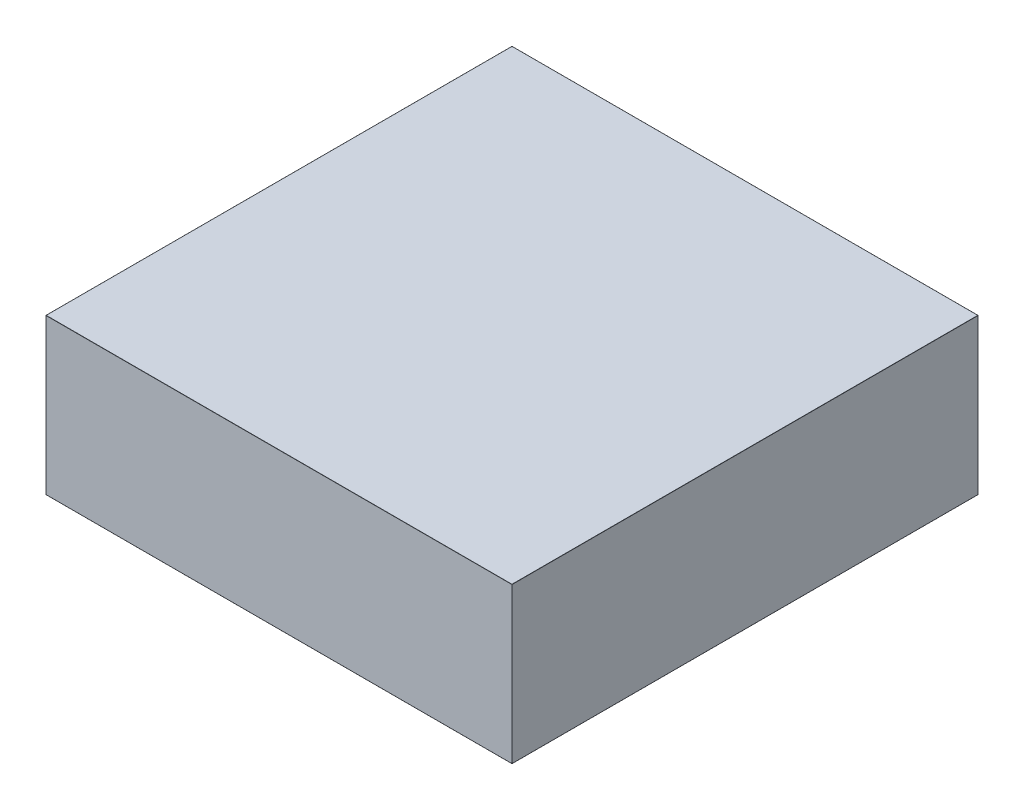
ISO-10303-21;
HEADER;
FILE_DESCRIPTION(('STEP AP214'),'2;1');
FILE_NAME('part.step','',(''),(''),'','','');
FILE_SCHEMA(('AUTOMOTIVE_DESIGN { 1 0 10303 214 1 1 1 1 }'));
ENDSEC;
DATA;
#1=APPLICATION_CONTEXT('core data for automotive mechanical design processes');
#2=APPLICATION_PROTOCOL_DEFINITION('international standard','automotive_design',2000,#1);
#3=PRODUCT_CONTEXT('',#1,'mechanical');
#4=PRODUCT('Part','Part','',(#3));
#5=PRODUCT_RELATED_PRODUCT_CATEGORY('part','',(#4));
#6=PRODUCT_DEFINITION_FORMATION('','',#4);
#7=PRODUCT_DEFINITION_CONTEXT('part definition',#1,'design');
#8=PRODUCT_DEFINITION('design','',#6,#7);
#9=PRODUCT_DEFINITION_SHAPE('','',#8);
#10=(LENGTH_UNIT() NAMED_UNIT(*) SI_UNIT(.MILLI.,.METRE.));
#11=(NAMED_UNIT(*) PLANE_ANGLE_UNIT() SI_UNIT($,.RADIAN.));
#12=(NAMED_UNIT(*) SI_UNIT($,.STERADIAN.) SOLID_ANGLE_UNIT());
#13=UNCERTAINTY_MEASURE_WITH_UNIT(LENGTH_MEASURE(1.E-05),#10,'distance_accuracy_value','');
#14=(GEOMETRIC_REPRESENTATION_CONTEXT(3) GLOBAL_UNCERTAINTY_ASSIGNED_CONTEXT((#13)) GLOBAL_UNIT_ASSIGNED_CONTEXT((#10,
#11,#12)) REPRESENTATION_CONTEXT('',''));
#15=CARTESIAN_POINT('',(0.,0.,0.));
#16=DIRECTION('',(0.,0.,1.));
#17=DIRECTION('',(1.,0.,0.));
#18=AXIS2_PLACEMENT_3D('',#15,#16,#17);
#19=CARTESIAN_POINT('',(150.,-50.,150.));
#20=DIRECTION('',(-1.,0.,0.));
#21=DIRECTION('',(0.,0.,1.));
#22=AXIS2_PLACEMENT_3D('',#19,#20,#21);
#23=PLANE('',#22);
#24=DIRECTION('',(0.,1.,0.));
#25=VECTOR('',#24,1.);
#26=CARTESIAN_POINT('',(150.,-50.,149.9));
#27=LINE('',#26,#25);
#28=CARTESIAN_POINT('',(150.,49.9,149.9));
#29=VERTEX_POINT('',#28);
#30=CARTESIAN_POINT('',(150.,-49.9,149.9));
#31=VERTEX_POINT('',#30);
#32=EDGE_CURVE('E183',#29,#31,#27,.F.);
#33=ORIENTED_EDGE('',*,*,#32,.T.);
#34=DIRECTION('',(0.,0.,-1.));
#35=VECTOR('',#34,1.);
#36=CARTESIAN_POINT('',(150.,-49.9,150.));
#37=LINE('',#36,#35);
#38=CARTESIAN_POINT('',(150.,-49.9,-149.9));
#39=VERTEX_POINT('',#38);
#40=EDGE_CURVE('E187',#31,#39,#37,.T.);
#41=ORIENTED_EDGE('',*,*,#40,.T.);
#42=DIRECTION('',(0.,1.,0.));
#43=VECTOR('',#42,1.);
#44=CARTESIAN_POINT('',(150.,50.,-149.9));
#45=LINE('',#44,#43);
#46=CARTESIAN_POINT('',(150.,49.9,-149.9));
#47=VERTEX_POINT('',#46);
#48=EDGE_CURVE('E185',#39,#47,#45,.T.);
#49=ORIENTED_EDGE('',*,*,#48,.T.);
#50=DIRECTION('',(0.,0.,-1.));
#51=VECTOR('',#50,1.);
#52=CARTESIAN_POINT('',(150.,49.9,150.));
#53=LINE('',#52,#51);
#54=EDGE_CURVE('E181',#47,#29,#53,.F.);
#55=ORIENTED_EDGE('',*,*,#54,.T.);
#56=EDGE_LOOP('',(#33,#41,#49,#55));
#57=FACE_BOUND('',#56,.T.);
#58=ADVANCED_FACE('F33',(#57),#23,.F.);
#59=CARTESIAN_POINT('',(-150.,50.,150.));
#60=DIRECTION('',(0.,-1.,0.));
#61=DIRECTION('',(0.,0.,-1.));
#62=AXIS2_PLACEMENT_3D('',#59,#60,#61);
#63=PLANE('',#62);
#64=DIRECTION('',(-1.,0.,0.));
#65=VECTOR('',#64,1.);
#66=CARTESIAN_POINT('',(-150.,50.,149.9));
#67=LINE('',#66,#65);
#68=CARTESIAN_POINT('',(-149.9,50.,149.9));
#69=VERTEX_POINT('',#68);
#70=CARTESIAN_POINT('',(149.9,50.,149.9));
#71=VERTEX_POINT('',#70);
#72=EDGE_CURVE('E42',#69,#71,#67,.F.);
#73=ORIENTED_EDGE('',*,*,#72,.T.);
#74=DIRECTION('',(0.,0.,-1.));
#75=VECTOR('',#74,1.);
#76=CARTESIAN_POINT('',(149.9,50.,150.));
#77=LINE('',#76,#75);
#78=CARTESIAN_POINT('',(149.9,50.,-149.9));
#79=VERTEX_POINT('',#78);
#80=EDGE_CURVE('E11',#71,#79,#77,.T.);
#81=ORIENTED_EDGE('',*,*,#80,.T.);
#82=DIRECTION('',(-1.,0.,0.));
#83=VECTOR('',#82,1.);
#84=CARTESIAN_POINT('',(-150.,50.,-149.9));
#85=LINE('',#84,#83);
#86=CARTESIAN_POINT('',(-149.9,50.,-149.9));
#87=VERTEX_POINT('',#86);
#88=EDGE_CURVE('E198',#79,#87,#85,.T.);
#89=ORIENTED_EDGE('',*,*,#88,.T.);
#90=DIRECTION('',(0.,0.,-1.));
#91=VECTOR('',#90,1.);
#92=CARTESIAN_POINT('',(-149.9,50.,150.));
#93=LINE('',#92,#91);
#94=EDGE_CURVE('E53',#87,#69,#93,.F.);
#95=ORIENTED_EDGE('',*,*,#94,.T.);
#96=EDGE_LOOP('',(#73,#81,#89,#95));
#97=FACE_BOUND('',#96,.T.);
#98=ADVANCED_FACE('F292',(#97),#63,.F.);
#99=CARTESIAN_POINT('',(-150.,-50.,150.));
#100=DIRECTION('',(1.,0.,0.));
#101=DIRECTION('',(0.,0.,-1.));
#102=AXIS2_PLACEMENT_3D('',#99,#100,#101);
#103=PLANE('',#102);
#104=DIRECTION('',(0.,0.,-1.));
#105=VECTOR('',#104,1.);
#106=CARTESIAN_POINT('',(-150.,49.9,150.));
#107=LINE('',#106,#105);
#108=CARTESIAN_POINT('',(-150.,49.9,149.9));
#109=VERTEX_POINT('',#108);
#110=CARTESIAN_POINT('',(-150.,49.9,-149.9));
#111=VERTEX_POINT('',#110);
#112=EDGE_CURVE('E125',#109,#111,#107,.T.);
#113=ORIENTED_EDGE('',*,*,#112,.T.);
#114=DIRECTION('',(0.,-1.,0.));
#115=VECTOR('',#114,1.);
#116=CARTESIAN_POINT('',(-150.,-50.,-149.9));
#117=LINE('',#116,#115);
#118=CARTESIAN_POINT('',(-150.,-49.9,-149.9));
#119=VERTEX_POINT('',#118);
#120=EDGE_CURVE('E161',#111,#119,#117,.T.);
#121=ORIENTED_EDGE('',*,*,#120,.T.);
#122=DIRECTION('',(0.,0.,-1.));
#123=VECTOR('',#122,1.);
#124=CARTESIAN_POINT('',(-150.,-49.9,150.));
#125=LINE('',#124,#123);
#126=CARTESIAN_POINT('',(-150.,-49.9,149.9));
#127=VERTEX_POINT('',#126);
#128=EDGE_CURVE('E128',#119,#127,#125,.F.);
#129=ORIENTED_EDGE('',*,*,#128,.T.);
#130=DIRECTION('',(0.,-1.,0.));
#131=VECTOR('',#130,1.);
#132=CARTESIAN_POINT('',(-150.,-50.,149.9));
#133=LINE('',#132,#131);
#134=EDGE_CURVE('E120',#127,#109,#133,.F.);
#135=ORIENTED_EDGE('',*,*,#134,.T.);
#136=EDGE_LOOP('',(#113,#121,#129,#135));
#137=FACE_BOUND('',#136,.T.);
#138=ADVANCED_FACE('F122',(#137),#103,.F.);
#139=CARTESIAN_POINT('',(-150.,-50.,150.));
#140=DIRECTION('',(0.,1.,0.));
#141=DIRECTION('',(0.,0.,1.));
#142=AXIS2_PLACEMENT_3D('',#139,#140,#141);
#143=PLANE('',#142);
#144=DIRECTION('',(1.,0.,0.));
#145=VECTOR('',#144,1.);
#146=CARTESIAN_POINT('',(-150.,-50.,149.9));
#147=LINE('',#146,#145);
#148=CARTESIAN_POINT('',(149.9,-50.,149.9));
#149=VERTEX_POINT('',#148);
#150=CARTESIAN_POINT('',(-149.9,-50.,149.9));
#151=VERTEX_POINT('',#150);
#152=EDGE_CURVE('E172',#149,#151,#147,.F.);
#153=ORIENTED_EDGE('',*,*,#152,.T.);
#154=DIRECTION('',(0.,0.,-1.));
#155=VECTOR('',#154,1.);
#156=CARTESIAN_POINT('',(-149.9,-50.,150.));
#157=LINE('',#156,#155);
#158=CARTESIAN_POINT('',(-149.9,-50.,-149.9));
#159=VERTEX_POINT('',#158);
#160=EDGE_CURVE('E178',#151,#159,#157,.T.);
#161=ORIENTED_EDGE('',*,*,#160,.T.);
#162=DIRECTION('',(1.,0.,0.));
#163=VECTOR('',#162,1.);
#164=CARTESIAN_POINT('',(150.,-50.,-149.9));
#165=LINE('',#164,#163);
#166=CARTESIAN_POINT('',(149.9,-50.,-149.9));
#167=VERTEX_POINT('',#166);
#168=EDGE_CURVE('E176',#159,#167,#165,.T.);
#169=ORIENTED_EDGE('',*,*,#168,.T.);
#170=DIRECTION('',(0.,0.,-1.));
#171=VECTOR('',#170,1.);
#172=CARTESIAN_POINT('',(149.9,-50.,150.));
#173=LINE('',#172,#171);
#174=EDGE_CURVE('E174',#167,#149,#173,.F.);
#175=ORIENTED_EDGE('',*,*,#174,.T.);
#176=EDGE_LOOP('',(#153,#161,#169,#175));
#177=FACE_BOUND('',#176,.T.);
#178=ADVANCED_FACE('F275',(#177),#143,.F.);
#179=CARTESIAN_POINT('',(0.,0.,150.));
#180=DIRECTION('',(0.,0.,-1.));
#181=DIRECTION('',(-1.,0.,0.));
#182=AXIS2_PLACEMENT_3D('',#179,#180,#181);
#183=PLANE('',#182);
#184=DIRECTION('',(0.,-1.,0.));
#185=VECTOR('',#184,1.);
#186=CARTESIAN_POINT('',(-149.9,0.,150.));
#187=LINE('',#186,#185);
#188=CARTESIAN_POINT('',(-149.9,49.9,150.));
#189=VERTEX_POINT('',#188);
#190=CARTESIAN_POINT('',(-149.9,-49.9,150.));
#191=VERTEX_POINT('',#190);
#192=EDGE_CURVE('E138',#189,#191,#187,.T.);
#193=ORIENTED_EDGE('',*,*,#192,.T.);
#194=DIRECTION('',(1.,0.,0.));
#195=VECTOR('',#194,1.);
#196=CARTESIAN_POINT('',(0.,-49.9,150.));
#197=LINE('',#196,#195);
#198=CARTESIAN_POINT('',(149.9,-49.9,150.));
#199=VERTEX_POINT('',#198);
#200=EDGE_CURVE('E195',#191,#199,#197,.T.);
#201=ORIENTED_EDGE('',*,*,#200,.T.);
#202=DIRECTION('',(0.,1.,0.));
#203=VECTOR('',#202,1.);
#204=CARTESIAN_POINT('',(149.9,0.,150.));
#205=LINE('',#204,#203);
#206=CARTESIAN_POINT('',(149.9,49.9,150.));
#207=VERTEX_POINT('',#206);
#208=EDGE_CURVE('E192',#199,#207,#205,.T.);
#209=ORIENTED_EDGE('',*,*,#208,.T.);
#210=DIRECTION('',(-1.,0.,0.));
#211=VECTOR('',#210,1.);
#212=CARTESIAN_POINT('',(0.,49.9,150.));
#213=LINE('',#212,#211);
#214=EDGE_CURVE('E190',#207,#189,#213,.T.);
#215=ORIENTED_EDGE('',*,*,#214,.T.);
#216=EDGE_LOOP('',(#193,#201,#209,#215));
#217=FACE_BOUND('',#216,.T.);
#218=ADVANCED_FACE('F262',(#217),#183,.F.);
#219=CARTESIAN_POINT('',(0.,0.,-150.));
#220=DIRECTION('',(0.,0.,-1.));
#221=DIRECTION('',(-1.,0.,0.));
#222=AXIS2_PLACEMENT_3D('',#219,#220,#221);
#223=PLANE('',#222);
#224=DIRECTION('',(1.,0.,0.));
#225=VECTOR('',#224,1.);
#226=CARTESIAN_POINT('',(-150.,-49.9,-150.));
#227=LINE('',#226,#225);
#228=CARTESIAN_POINT('',(149.9,-49.9,-150.));
#229=VERTEX_POINT('',#228);
#230=CARTESIAN_POINT('',(-149.9,-49.9,-150.));
#231=VERTEX_POINT('',#230);
#232=EDGE_CURVE('E167',#229,#231,#227,.F.);
#233=ORIENTED_EDGE('',*,*,#232,.T.);
#234=DIRECTION('',(0.,-1.,0.));
#235=VECTOR('',#234,1.);
#236=CARTESIAN_POINT('',(-149.9,50.,-150.));
#237=LINE('',#236,#235);
#238=CARTESIAN_POINT('',(-149.9,49.9,-150.));
#239=VERTEX_POINT('',#238);
#240=EDGE_CURVE('E169',#231,#239,#237,.F.);
#241=ORIENTED_EDGE('',*,*,#240,.T.);
#242=DIRECTION('',(-1.,0.,0.));
#243=VECTOR('',#242,1.);
#244=CARTESIAN_POINT('',(150.,49.9,-150.));
#245=LINE('',#244,#243);
#246=CARTESIAN_POINT('',(149.9,49.9,-150.));
#247=VERTEX_POINT('',#246);
#248=EDGE_CURVE('E163',#239,#247,#245,.F.);
#249=ORIENTED_EDGE('',*,*,#248,.T.);
#250=DIRECTION('',(0.,1.,0.));
#251=VECTOR('',#250,1.);
#252=CARTESIAN_POINT('',(149.9,-50.,-150.));
#253=LINE('',#252,#251);
#254=EDGE_CURVE('E165',#247,#229,#253,.F.);
#255=ORIENTED_EDGE('',*,*,#254,.T.);
#256=EDGE_LOOP('',(#233,#241,#249,#255));
#257=FACE_BOUND('',#256,.T.);
#258=ADVANCED_FACE('F478',(#257),#223,.T.);
#259=CARTESIAN_POINT('',(149.9,0.,149.9));
#260=DIRECTION('',(0.,1.,0.));
#261=DIRECTION('',(0.,0.,1.));
#262=AXIS2_PLACEMENT_3D('',#259,#260,#261);
#263=CYLINDRICAL_SURFACE('',#262,0.1);
#264=CARTESIAN_POINT('',(149.9,49.9,149.9));
#265=DIRECTION('',(0.,1.,0.));
#266=DIRECTION('',(0.,0.,1.));
#267=AXIS2_PLACEMENT_3D('',#264,#265,#266);
#268=CIRCLE('',#267,0.1);
#269=EDGE_CURVE('E37',#207,#29,#268,.T.);
#270=ORIENTED_EDGE('',*,*,#269,.F.);
#271=ORIENTED_EDGE('',*,*,#208,.F.);
#272=CARTESIAN_POINT('',(149.9,-49.9,149.9));
#273=DIRECTION('',(0.,-1.,0.));
#274=DIRECTION('',(0.,0.,-1.));
#275=AXIS2_PLACEMENT_3D('',#272,#273,#274);
#276=CIRCLE('',#275,0.1);
#277=EDGE_CURVE('E158',#31,#199,#276,.T.);
#278=ORIENTED_EDGE('',*,*,#277,.F.);
#279=ORIENTED_EDGE('',*,*,#32,.F.);
#280=EDGE_LOOP('',(#270,#271,#278,#279));
#281=FACE_BOUND('',#280,.T.);
#282=ADVANCED_FACE('F35',(#281),#263,.T.);
#283=CARTESIAN_POINT('',(149.9,49.9,149.9));
#284=DIRECTION('',(0.,0.,1.));
#285=DIRECTION('',(1.,0.,0.));
#286=AXIS2_PLACEMENT_3D('',#283,#284,#285);
#287=SPHERICAL_SURFACE('',#286,0.1);
#288=CARTESIAN_POINT('',(149.9,49.9,149.9));
#289=DIRECTION('',(1.,0.,0.));
#290=DIRECTION('',(0.,0.,-1.));
#291=AXIS2_PLACEMENT_3D('',#288,#289,#290);
#292=CIRCLE('',#291,0.1);
#293=EDGE_CURVE('E243',#207,#71,#292,.F.);
#294=ORIENTED_EDGE('',*,*,#293,.F.);
#295=ORIENTED_EDGE('',*,*,#269,.T.);
#296=CARTESIAN_POINT('',(149.9,49.9,149.9));
#297=DIRECTION('',(0.,0.,1.));
#298=DIRECTION('',(1.,0.,0.));
#299=AXIS2_PLACEMENT_3D('',#296,#297,#298);
#300=CIRCLE('',#299,0.1);
#301=EDGE_CURVE('E245',#71,#29,#300,.F.);
#302=ORIENTED_EDGE('',*,*,#301,.F.);
#303=EDGE_LOOP('',(#294,#295,#302));
#304=FACE_BOUND('',#303,.T.);
#305=ADVANCED_FACE('F285',(#304),#287,.T.);
#306=CARTESIAN_POINT('',(149.9,-49.9,149.9));
#307=DIRECTION('',(0.,0.,1.));
#308=DIRECTION('',(1.,0.,0.));
#309=AXIS2_PLACEMENT_3D('',#306,#307,#308);
#310=SPHERICAL_SURFACE('',#309,0.1);
#311=CARTESIAN_POINT('',(149.9,-49.9,149.9));
#312=DIRECTION('',(0.,0.,1.));
#313=DIRECTION('',(1.,0.,0.));
#314=AXIS2_PLACEMENT_3D('',#311,#312,#313);
#315=CIRCLE('',#314,0.1);
#316=EDGE_CURVE('E238',#31,#149,#315,.F.);
#317=ORIENTED_EDGE('',*,*,#316,.F.);
#318=ORIENTED_EDGE('',*,*,#277,.T.);
#319=CARTESIAN_POINT('',(149.9,-49.9,149.9));
#320=DIRECTION('',(1.,0.,0.));
#321=DIRECTION('',(0.,0.,-1.));
#322=AXIS2_PLACEMENT_3D('',#319,#320,#321);
#323=CIRCLE('',#322,0.1);
#324=EDGE_CURVE('E241',#149,#199,#323,.F.);
#325=ORIENTED_EDGE('',*,*,#324,.F.);
#326=EDGE_LOOP('',(#317,#318,#325));
#327=FACE_BOUND('',#326,.T.);
#328=ADVANCED_FACE('F253',(#327),#310,.T.);
#329=CARTESIAN_POINT('',(149.9,49.9,150.));
#330=DIRECTION('',(0.,0.,-1.));
#331=DIRECTION('',(-1.,0.,0.));
#332=AXIS2_PLACEMENT_3D('',#329,#330,#331);
#333=CYLINDRICAL_SURFACE('',#332,0.1);
#334=ORIENTED_EDGE('',*,*,#301,.T.);
#335=ORIENTED_EDGE('',*,*,#54,.F.);
#336=CARTESIAN_POINT('',(149.9,49.9,-149.9));
#337=DIRECTION('',(0.,0.,-1.));
#338=DIRECTION('',(-1.,0.,0.));
#339=AXIS2_PLACEMENT_3D('',#336,#337,#338);
#340=CIRCLE('',#339,0.1);
#341=EDGE_CURVE('E232',#79,#47,#340,.T.);
#342=ORIENTED_EDGE('',*,*,#341,.F.);
#343=ORIENTED_EDGE('',*,*,#80,.F.);
#344=EDGE_LOOP('',(#334,#335,#342,#343));
#345=FACE_BOUND('',#344,.T.);
#346=ADVANCED_FACE('F289',(#345),#333,.T.);
#347=CARTESIAN_POINT('',(0.,49.9,149.9));
#348=DIRECTION('',(-1.,0.,0.));
#349=DIRECTION('',(0.,0.,1.));
#350=AXIS2_PLACEMENT_3D('',#347,#348,#349);
#351=CYLINDRICAL_SURFACE('',#350,0.1);
#352=ORIENTED_EDGE('',*,*,#293,.T.);
#353=ORIENTED_EDGE('',*,*,#72,.F.);
#354=CARTESIAN_POINT('',(-149.9,49.9,149.9));
#355=DIRECTION('',(-1.,0.,0.));
#356=DIRECTION('',(0.,0.,1.));
#357=AXIS2_PLACEMENT_3D('',#354,#355,#356);
#358=CIRCLE('',#357,0.1);
#359=EDGE_CURVE('E142',#189,#69,#358,.T.);
#360=ORIENTED_EDGE('',*,*,#359,.F.);
#361=ORIENTED_EDGE('',*,*,#214,.F.);
#362=EDGE_LOOP('',(#352,#353,#360,#361));
#363=FACE_BOUND('',#362,.T.);
#364=ADVANCED_FACE('F442',(#363),#351,.T.);
#365=CARTESIAN_POINT('',(-149.9,0.,149.9));
#366=DIRECTION('',(0.,-1.,0.));
#367=DIRECTION('',(0.,0.,-1.));
#368=AXIS2_PLACEMENT_3D('',#365,#366,#367);
#369=CYLINDRICAL_SURFACE('',#368,0.1);
#370=CARTESIAN_POINT('',(-149.9,-49.9,149.9));
#371=DIRECTION('',(0.,-1.,0.));
#372=DIRECTION('',(0.,0.,-1.));
#373=AXIS2_PLACEMENT_3D('',#370,#371,#372);
#374=CIRCLE('',#373,0.1);
#375=EDGE_CURVE('E143',#191,#127,#374,.T.);
#376=ORIENTED_EDGE('',*,*,#375,.F.);
#377=ORIENTED_EDGE('',*,*,#192,.F.);
#378=CARTESIAN_POINT('',(-149.9,49.9,149.9));
#379=DIRECTION('',(0.,1.,0.));
#380=DIRECTION('',(0.,0.,1.));
#381=AXIS2_PLACEMENT_3D('',#378,#379,#380);
#382=CIRCLE('',#381,0.1);
#383=EDGE_CURVE('E135',#109,#189,#382,.T.);
#384=ORIENTED_EDGE('',*,*,#383,.F.);
#385=ORIENTED_EDGE('',*,*,#134,.F.);
#386=EDGE_LOOP('',(#376,#377,#384,#385));
#387=FACE_BOUND('',#386,.T.);
#388=ADVANCED_FACE('F137',(#387),#369,.T.);
#389=CARTESIAN_POINT('',(0.,-49.9,149.9));
#390=DIRECTION('',(1.,0.,0.));
#391=DIRECTION('',(0.,0.,-1.));
#392=AXIS2_PLACEMENT_3D('',#389,#390,#391);
#393=CYLINDRICAL_SURFACE('',#392,0.1);
#394=ORIENTED_EDGE('',*,*,#324,.T.);
#395=ORIENTED_EDGE('',*,*,#200,.F.);
#396=CARTESIAN_POINT('',(-149.9,-49.9,149.9));
#397=DIRECTION('',(-1.,0.,0.));
#398=DIRECTION('',(0.,0.,1.));
#399=AXIS2_PLACEMENT_3D('',#396,#397,#398);
#400=CIRCLE('',#399,0.1);
#401=EDGE_CURVE('E227',#151,#191,#400,.T.);
#402=ORIENTED_EDGE('',*,*,#401,.F.);
#403=ORIENTED_EDGE('',*,*,#152,.F.);
#404=EDGE_LOOP('',(#394,#395,#402,#403));
#405=FACE_BOUND('',#404,.T.);
#406=ADVANCED_FACE('F265',(#405),#393,.T.);
#407=CARTESIAN_POINT('',(149.9,-49.9,150.));
#408=DIRECTION('',(0.,0.,-1.));
#409=DIRECTION('',(-1.,0.,0.));
#410=AXIS2_PLACEMENT_3D('',#407,#408,#409);
#411=CYLINDRICAL_SURFACE('',#410,0.1);
#412=ORIENTED_EDGE('',*,*,#316,.T.);
#413=ORIENTED_EDGE('',*,*,#174,.F.);
#414=CARTESIAN_POINT('',(149.9,-49.9,-149.9));
#415=DIRECTION('',(0.,0.,-1.));
#416=DIRECTION('',(-1.,0.,0.));
#417=AXIS2_PLACEMENT_3D('',#414,#415,#416);
#418=CIRCLE('',#417,0.1);
#419=EDGE_CURVE('E224',#39,#167,#418,.T.);
#420=ORIENTED_EDGE('',*,*,#419,.F.);
#421=ORIENTED_EDGE('',*,*,#40,.F.);
#422=EDGE_LOOP('',(#412,#413,#420,#421));
#423=FACE_BOUND('',#422,.T.);
#424=ADVANCED_FACE('F279',(#423),#411,.T.);
#425=CARTESIAN_POINT('',(149.9,-50.,-149.9));
#426=DIRECTION('',(0.,-1.,0.));
#427=DIRECTION('',(0.,0.,-1.));
#428=AXIS2_PLACEMENT_3D('',#425,#426,#427);
#429=CYLINDRICAL_SURFACE('',#428,0.1);
#430=CARTESIAN_POINT('',(149.9,49.9,-149.9));
#431=DIRECTION('',(0.,1.,0.));
#432=DIRECTION('',(0.,0.,1.));
#433=AXIS2_PLACEMENT_3D('',#430,#431,#432);
#434=CIRCLE('',#433,0.1);
#435=EDGE_CURVE('E235',#47,#247,#434,.T.);
#436=ORIENTED_EDGE('',*,*,#435,.F.);
#437=ORIENTED_EDGE('',*,*,#48,.F.);
#438=CARTESIAN_POINT('',(149.9,-49.9,-149.9));
#439=DIRECTION('',(0.,-1.,0.));
#440=DIRECTION('',(0.,0.,-1.));
#441=AXIS2_PLACEMENT_3D('',#438,#439,#440);
#442=CIRCLE('',#441,0.1);
#443=EDGE_CURVE('E222',#229,#39,#442,.T.);
#444=ORIENTED_EDGE('',*,*,#443,.F.);
#445=ORIENTED_EDGE('',*,*,#254,.F.);
#446=EDGE_LOOP('',(#436,#437,#444,#445));
#447=FACE_BOUND('',#446,.T.);
#448=ADVANCED_FACE('F317',(#447),#429,.T.);
#449=CARTESIAN_POINT('',(149.9,49.9,-149.9));
#450=DIRECTION('',(0.,0.,1.));
#451=DIRECTION('',(1.,0.,0.));
#452=AXIS2_PLACEMENT_3D('',#449,#450,#451);
#453=SPHERICAL_SURFACE('',#452,0.1);
#454=ORIENTED_EDGE('',*,*,#341,.T.);
#455=ORIENTED_EDGE('',*,*,#435,.T.);
#456=CARTESIAN_POINT('',(149.9,49.9,-149.9));
#457=DIRECTION('',(1.,0.,0.));
#458=DIRECTION('',(0.,0.,-1.));
#459=AXIS2_PLACEMENT_3D('',#456,#457,#458);
#460=CIRCLE('',#459,0.1);
#461=EDGE_CURVE('E149',#79,#247,#460,.F.);
#462=ORIENTED_EDGE('',*,*,#461,.F.);
#463=EDGE_LOOP('',(#454,#455,#462));
#464=FACE_BOUND('',#463,.T.);
#465=ADVANCED_FACE('F319',(#464),#453,.T.);
#466=CARTESIAN_POINT('',(-149.9,49.9,149.9));
#467=DIRECTION('',(0.,0.,1.));
#468=DIRECTION('',(1.,0.,0.));
#469=AXIS2_PLACEMENT_3D('',#466,#467,#468);
#470=SPHERICAL_SURFACE('',#469,0.1);
#471=ORIENTED_EDGE('',*,*,#383,.T.);
#472=ORIENTED_EDGE('',*,*,#359,.T.);
#473=CARTESIAN_POINT('',(-149.9,49.9,149.9));
#474=DIRECTION('',(0.,0.,1.));
#475=DIRECTION('',(1.,0.,0.));
#476=AXIS2_PLACEMENT_3D('',#473,#474,#475);
#477=CIRCLE('',#476,0.1);
#478=EDGE_CURVE('E146',#109,#69,#477,.F.);
#479=ORIENTED_EDGE('',*,*,#478,.F.);
#480=EDGE_LOOP('',(#471,#472,#479));
#481=FACE_BOUND('',#480,.T.);
#482=ADVANCED_FACE('F147',(#481),#470,.T.);
#483=CARTESIAN_POINT('',(-149.9,-49.9,149.9));
#484=DIRECTION('',(0.,0.,1.));
#485=DIRECTION('',(1.,0.,0.));
#486=AXIS2_PLACEMENT_3D('',#483,#484,#485);
#487=SPHERICAL_SURFACE('',#486,0.1);
#488=ORIENTED_EDGE('',*,*,#401,.T.);
#489=ORIENTED_EDGE('',*,*,#375,.T.);
#490=CARTESIAN_POINT('',(-149.9,-49.9,149.9));
#491=DIRECTION('',(0.,0.,1.));
#492=DIRECTION('',(1.,0.,0.));
#493=AXIS2_PLACEMENT_3D('',#490,#491,#492);
#494=CIRCLE('',#493,0.1);
#495=EDGE_CURVE('E150',#151,#127,#494,.F.);
#496=ORIENTED_EDGE('',*,*,#495,.F.);
#497=EDGE_LOOP('',(#488,#489,#496));
#498=FACE_BOUND('',#497,.T.);
#499=ADVANCED_FACE('F268',(#498),#487,.T.);
#500=CARTESIAN_POINT('',(149.9,-49.9,-149.9));
#501=DIRECTION('',(0.,0.,1.));
#502=DIRECTION('',(1.,0.,0.));
#503=AXIS2_PLACEMENT_3D('',#500,#501,#502);
#504=SPHERICAL_SURFACE('',#503,0.1);
#505=ORIENTED_EDGE('',*,*,#443,.T.);
#506=ORIENTED_EDGE('',*,*,#419,.T.);
#507=CARTESIAN_POINT('',(149.9,-49.9,-149.9));
#508=DIRECTION('',(1.,0.,0.));
#509=DIRECTION('',(0.,0.,-1.));
#510=AXIS2_PLACEMENT_3D('',#507,#508,#509);
#511=CIRCLE('',#510,0.1);
#512=EDGE_CURVE('E215',#229,#167,#511,.F.);
#513=ORIENTED_EDGE('',*,*,#512,.F.);
#514=EDGE_LOOP('',(#505,#506,#513));
#515=FACE_BOUND('',#514,.T.);
#516=ADVANCED_FACE('F313',(#515),#504,.T.);
#517=CARTESIAN_POINT('',(-150.,49.9,-149.9));
#518=DIRECTION('',(1.,0.,0.));
#519=DIRECTION('',(0.,0.,-1.));
#520=AXIS2_PLACEMENT_3D('',#517,#518,#519);
#521=CYLINDRICAL_SURFACE('',#520,0.1);
#522=ORIENTED_EDGE('',*,*,#461,.T.);
#523=ORIENTED_EDGE('',*,*,#248,.F.);
#524=CARTESIAN_POINT('',(-149.9,49.9,-149.9));
#525=DIRECTION('',(-1.,0.,0.));
#526=DIRECTION('',(0.,0.,1.));
#527=AXIS2_PLACEMENT_3D('',#524,#525,#526);
#528=CIRCLE('',#527,0.1);
#529=EDGE_CURVE('E212',#87,#239,#528,.T.);
#530=ORIENTED_EDGE('',*,*,#529,.F.);
#531=ORIENTED_EDGE('',*,*,#88,.F.);
#532=EDGE_LOOP('',(#522,#523,#530,#531));
#533=FACE_BOUND('',#532,.T.);
#534=ADVANCED_FACE('F297',(#533),#521,.T.);
#535=CARTESIAN_POINT('',(-149.9,49.9,150.));
#536=DIRECTION('',(0.,0.,-1.));
#537=DIRECTION('',(-1.,0.,0.));
#538=AXIS2_PLACEMENT_3D('',#535,#536,#537);
#539=CYLINDRICAL_SURFACE('',#538,0.1);
#540=ORIENTED_EDGE('',*,*,#478,.T.);
#541=ORIENTED_EDGE('',*,*,#94,.F.);
#542=CARTESIAN_POINT('',(-149.9,49.9,-149.9));
#543=DIRECTION('',(0.,0.,-1.));
#544=DIRECTION('',(-1.,0.,0.));
#545=AXIS2_PLACEMENT_3D('',#542,#543,#544);
#546=CIRCLE('',#545,0.1);
#547=EDGE_CURVE('E154',#111,#87,#546,.T.);
#548=ORIENTED_EDGE('',*,*,#547,.F.);
#549=ORIENTED_EDGE('',*,*,#112,.F.);
#550=EDGE_LOOP('',(#540,#541,#548,#549));
#551=FACE_BOUND('',#550,.T.);
#552=ADVANCED_FACE('F152',(#551),#539,.T.);
#553=CARTESIAN_POINT('',(-149.9,-49.9,150.));
#554=DIRECTION('',(0.,0.,-1.));
#555=DIRECTION('',(-1.,0.,0.));
#556=AXIS2_PLACEMENT_3D('',#553,#554,#555);
#557=CYLINDRICAL_SURFACE('',#556,0.1);
#558=ORIENTED_EDGE('',*,*,#495,.T.);
#559=ORIENTED_EDGE('',*,*,#128,.F.);
#560=CARTESIAN_POINT('',(-149.9,-49.9,-149.9));
#561=DIRECTION('',(0.,0.,-1.));
#562=DIRECTION('',(-1.,0.,0.));
#563=AXIS2_PLACEMENT_3D('',#560,#561,#562);
#564=CIRCLE('',#563,0.1);
#565=EDGE_CURVE('E208',#159,#119,#564,.T.);
#566=ORIENTED_EDGE('',*,*,#565,.F.);
#567=ORIENTED_EDGE('',*,*,#160,.F.);
#568=EDGE_LOOP('',(#558,#559,#566,#567));
#569=FACE_BOUND('',#568,.T.);
#570=ADVANCED_FACE('F272',(#569),#557,.T.);
#571=CARTESIAN_POINT('',(-150.,-49.9,-149.9));
#572=DIRECTION('',(-1.,0.,0.));
#573=DIRECTION('',(0.,0.,1.));
#574=AXIS2_PLACEMENT_3D('',#571,#572,#573);
#575=CYLINDRICAL_SURFACE('',#574,0.1);
#576=ORIENTED_EDGE('',*,*,#512,.T.);
#577=ORIENTED_EDGE('',*,*,#168,.F.);
#578=CARTESIAN_POINT('',(-149.9,-49.9,-149.9));
#579=DIRECTION('',(-1.,0.,0.));
#580=DIRECTION('',(0.,0.,1.));
#581=AXIS2_PLACEMENT_3D('',#578,#579,#580);
#582=CIRCLE('',#581,0.1);
#583=EDGE_CURVE('E206',#231,#159,#582,.T.);
#584=ORIENTED_EDGE('',*,*,#583,.F.);
#585=ORIENTED_EDGE('',*,*,#232,.F.);
#586=EDGE_LOOP('',(#576,#577,#584,#585));
#587=FACE_BOUND('',#586,.T.);
#588=ADVANCED_FACE('F310',(#587),#575,.T.);
#589=CARTESIAN_POINT('',(-149.9,49.9,-149.9));
#590=DIRECTION('',(0.,0.,1.));
#591=DIRECTION('',(1.,0.,0.));
#592=AXIS2_PLACEMENT_3D('',#589,#590,#591);
#593=SPHERICAL_SURFACE('',#592,0.1);
#594=ORIENTED_EDGE('',*,*,#547,.T.);
#595=ORIENTED_EDGE('',*,*,#529,.T.);
#596=CARTESIAN_POINT('',(-149.9,49.9,-149.9));
#597=DIRECTION('',(0.,1.,0.));
#598=DIRECTION('',(0.,0.,1.));
#599=AXIS2_PLACEMENT_3D('',#596,#597,#598);
#600=CIRCLE('',#599,0.1);
#601=EDGE_CURVE('E204',#111,#239,#600,.F.);
#602=ORIENTED_EDGE('',*,*,#601,.F.);
#603=EDGE_LOOP('',(#594,#595,#602));
#604=FACE_BOUND('',#603,.T.);
#605=ADVANCED_FACE('F299',(#604),#593,.T.);
#606=CARTESIAN_POINT('',(-149.9,-49.9,-149.9));
#607=DIRECTION('',(0.,0.,1.));
#608=DIRECTION('',(1.,0.,0.));
#609=AXIS2_PLACEMENT_3D('',#606,#607,#608);
#610=SPHERICAL_SURFACE('',#609,0.1);
#611=ORIENTED_EDGE('',*,*,#583,.T.);
#612=ORIENTED_EDGE('',*,*,#565,.T.);
#613=CARTESIAN_POINT('',(-149.9,-49.9,-149.9));
#614=DIRECTION('',(0.,-1.,0.));
#615=DIRECTION('',(0.,0.,-1.));
#616=AXIS2_PLACEMENT_3D('',#613,#614,#615);
#617=CIRCLE('',#616,0.1);
#618=EDGE_CURVE('E202',#231,#119,#617,.F.);
#619=ORIENTED_EDGE('',*,*,#618,.F.);
#620=EDGE_LOOP('',(#611,#612,#619));
#621=FACE_BOUND('',#620,.T.);
#622=ADVANCED_FACE('F306',(#621),#610,.T.);
#623=CARTESIAN_POINT('',(-149.9,-50.,-149.9));
#624=DIRECTION('',(0.,1.,0.));
#625=DIRECTION('',(0.,0.,1.));
#626=AXIS2_PLACEMENT_3D('',#623,#624,#625);
#627=CYLINDRICAL_SURFACE('',#626,0.1);
#628=ORIENTED_EDGE('',*,*,#601,.T.);
#629=ORIENTED_EDGE('',*,*,#240,.F.);
#630=ORIENTED_EDGE('',*,*,#618,.T.);
#631=ORIENTED_EDGE('',*,*,#120,.F.);
#632=EDGE_LOOP('',(#628,#629,#630,#631));
#633=FACE_BOUND('',#632,.T.);
#634=ADVANCED_FACE('F303',(#633),#627,.T.);
#635=CLOSED_SHELL('',(#58,#98,#138,#178,#218,#258,#282,#305,#328,#346,#364,#388,#406,#424,#448,
#465,#482,#499,#516,#534,#552,#570,#588,#605,#622,#634));
#636=MANIFOLD_SOLID_BREP('B2',#635);
#637=ADVANCED_BREP_SHAPE_REPRESENTATION('',(#18,#636),#14);
#638=SHAPE_DEFINITION_REPRESENTATION(#9,#637);
ENDSEC;
END-ISO-10303-21;
